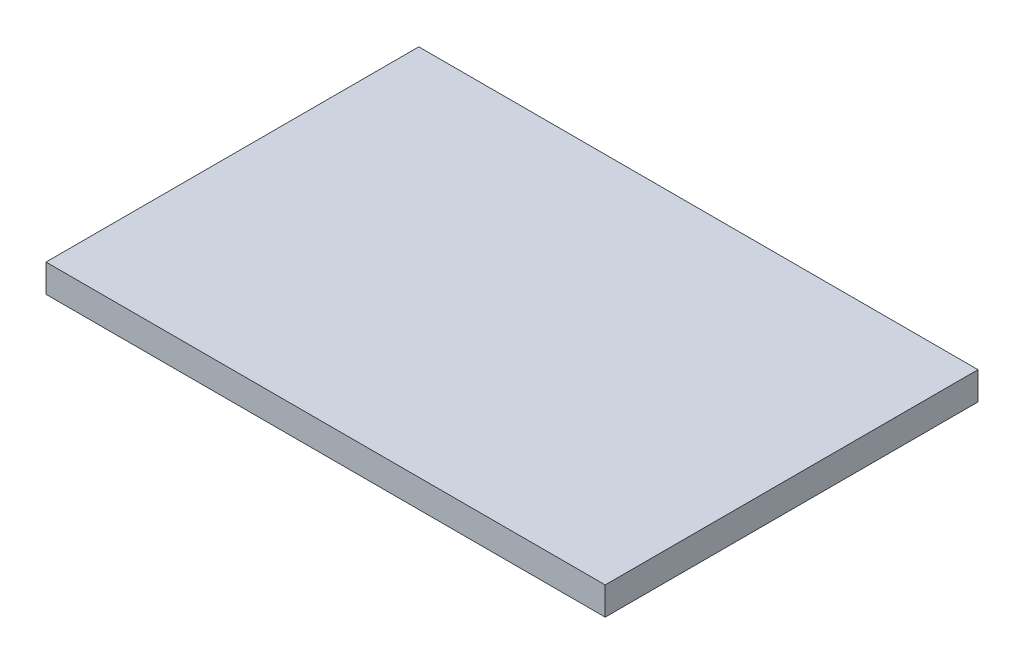
ISO-10303-21;
HEADER;
FILE_DESCRIPTION(('STEP AP214'),'2;1');
FILE_NAME('part.step','',(''),(''),'','','');
FILE_SCHEMA(('AUTOMOTIVE_DESIGN { 1 0 10303 214 1 1 1 1 }'));
ENDSEC;
DATA;
#1=APPLICATION_CONTEXT('core data for automotive mechanical design processes');
#2=APPLICATION_PROTOCOL_DEFINITION('international standard','automotive_design',2000,#1);
#3=PRODUCT_CONTEXT('',#1,'mechanical');
#4=PRODUCT('Part','Part','',(#3));
#5=PRODUCT_RELATED_PRODUCT_CATEGORY('part','',(#4));
#6=PRODUCT_DEFINITION_FORMATION('','',#4);
#7=PRODUCT_DEFINITION_CONTEXT('part definition',#1,'design');
#8=PRODUCT_DEFINITION('design','',#6,#7);
#9=PRODUCT_DEFINITION_SHAPE('','',#8);
#10=(LENGTH_UNIT() NAMED_UNIT(*) SI_UNIT(.MILLI.,.METRE.));
#11=(NAMED_UNIT(*) PLANE_ANGLE_UNIT() SI_UNIT($,.RADIAN.));
#12=(NAMED_UNIT(*) SI_UNIT($,.STERADIAN.) SOLID_ANGLE_UNIT());
#13=UNCERTAINTY_MEASURE_WITH_UNIT(LENGTH_MEASURE(1.E-05),#10,'distance_accuracy_value','');
#14=(GEOMETRIC_REPRESENTATION_CONTEXT(3) GLOBAL_UNCERTAINTY_ASSIGNED_CONTEXT((#13)) GLOBAL_UNIT_ASSIGNED_CONTEXT((#10,
#11,#12)) REPRESENTATION_CONTEXT('',''));
#15=CARTESIAN_POINT('',(0.,0.,0.));
#16=DIRECTION('',(0.,0.,1.));
#17=DIRECTION('',(1.,0.,0.));
#18=AXIS2_PLACEMENT_3D('',#15,#16,#17);
#19=CARTESIAN_POINT('',(0.,3.,0.));
#20=DIRECTION('',(1.,0.,0.));
#21=DIRECTION('',(0.,0.,-1.));
#22=AXIS2_PLACEMENT_3D('',#19,#20,#21);
#23=PLANE('',#22);
#24=DIRECTION('',(0.,0.,1.));
#25=VECTOR('',#24,1.);
#26=CARTESIAN_POINT('',(0.,0.,0.));
#27=LINE('',#26,#25);
#28=CARTESIAN_POINT('',(0.,0.,-40.));
#29=VERTEX_POINT('',#28);
#30=CARTESIAN_POINT('',(0.,0.,0.));
#31=VERTEX_POINT('',#30);
#32=EDGE_CURVE('E96',#29,#31,#27,.T.);
#33=ORIENTED_EDGE('',*,*,#32,.T.);
#34=DIRECTION('',(0.,-1.,0.));
#35=VECTOR('',#34,1.);
#36=CARTESIAN_POINT('',(0.,3.,0.));
#37=LINE('',#36,#35);
#38=CARTESIAN_POINT('',(0.,3.,0.));
#39=VERTEX_POINT('',#38);
#40=EDGE_CURVE('E11',#39,#31,#37,.T.);
#41=ORIENTED_EDGE('',*,*,#40,.F.);
#42=DIRECTION('',(0.,0.,1.));
#43=VECTOR('',#42,1.);
#44=CARTESIAN_POINT('',(0.,3.,0.));
#45=LINE('',#44,#43);
#46=CARTESIAN_POINT('',(0.,3.,-40.));
#47=VERTEX_POINT('',#46);
#48=EDGE_CURVE('E84',#47,#39,#45,.T.);
#49=ORIENTED_EDGE('',*,*,#48,.F.);
#50=DIRECTION('',(0.,-1.,0.));
#51=VECTOR('',#50,1.);
#52=CARTESIAN_POINT('',(0.,3.,-40.));
#53=LINE('',#52,#51);
#54=EDGE_CURVE('E92',#47,#29,#53,.T.);
#55=ORIENTED_EDGE('',*,*,#54,.T.);
#56=EDGE_LOOP('',(#33,#41,#49,#55));
#57=FACE_BOUND('',#56,.T.);
#58=ADVANCED_FACE('F33',(#57),#23,.F.);
#59=CARTESIAN_POINT('',(0.,3.,0.));
#60=DIRECTION('',(0.,0.,-1.));
#61=DIRECTION('',(-1.,0.,0.));
#62=AXIS2_PLACEMENT_3D('',#59,#60,#61);
#63=PLANE('',#62);
#64=DIRECTION('',(1.,0.,0.));
#65=VECTOR('',#64,1.);
#66=CARTESIAN_POINT('',(0.,0.,0.));
#67=LINE('',#66,#65);
#68=CARTESIAN_POINT('',(60.,0.,0.));
#69=VERTEX_POINT('',#68);
#70=EDGE_CURVE('E88',#31,#69,#67,.T.);
#71=ORIENTED_EDGE('',*,*,#70,.T.);
#72=DIRECTION('',(0.,-1.,0.));
#73=VECTOR('',#72,1.);
#74=CARTESIAN_POINT('',(60.,3.,0.));
#75=LINE('',#74,#73);
#76=CARTESIAN_POINT('',(60.,3.,0.));
#77=VERTEX_POINT('',#76);
#78=EDGE_CURVE('E41',#77,#69,#75,.T.);
#79=ORIENTED_EDGE('',*,*,#78,.F.);
#80=DIRECTION('',(1.,0.,0.));
#81=VECTOR('',#80,1.);
#82=CARTESIAN_POINT('',(0.,3.,0.));
#83=LINE('',#82,#81);
#84=EDGE_CURVE('E79',#39,#77,#83,.T.);
#85=ORIENTED_EDGE('',*,*,#84,.F.);
#86=ORIENTED_EDGE('',*,*,#40,.T.);
#87=EDGE_LOOP('',(#71,#79,#85,#86));
#88=FACE_BOUND('',#87,.T.);
#89=ADVANCED_FACE('F87',(#88),#63,.F.);
#90=CARTESIAN_POINT('',(60.,3.,0.));
#91=DIRECTION('',(-1.,0.,0.));
#92=DIRECTION('',(0.,0.,1.));
#93=AXIS2_PLACEMENT_3D('',#90,#91,#92);
#94=PLANE('',#93);
#95=DIRECTION('',(0.,0.,-1.));
#96=VECTOR('',#95,1.);
#97=CARTESIAN_POINT('',(60.,0.,0.));
#98=LINE('',#97,#96);
#99=CARTESIAN_POINT('',(60.,0.,-40.));
#100=VERTEX_POINT('',#99);
#101=EDGE_CURVE('E66',#69,#100,#98,.T.);
#102=ORIENTED_EDGE('',*,*,#101,.T.);
#103=DIRECTION('',(0.,-1.,0.));
#104=VECTOR('',#103,1.);
#105=CARTESIAN_POINT('',(60.,3.,-40.));
#106=LINE('',#105,#104);
#107=CARTESIAN_POINT('',(60.,3.,-40.));
#108=VERTEX_POINT('',#107);
#109=EDGE_CURVE('E89',#108,#100,#106,.T.);
#110=ORIENTED_EDGE('',*,*,#109,.F.);
#111=DIRECTION('',(0.,0.,-1.));
#112=VECTOR('',#111,1.);
#113=CARTESIAN_POINT('',(60.,3.,0.));
#114=LINE('',#113,#112);
#115=EDGE_CURVE('E82',#77,#108,#114,.T.);
#116=ORIENTED_EDGE('',*,*,#115,.F.);
#117=ORIENTED_EDGE('',*,*,#78,.T.);
#118=EDGE_LOOP('',(#102,#110,#116,#117));
#119=FACE_BOUND('',#118,.T.);
#120=ADVANCED_FACE('F90',(#119),#94,.F.);
#121=CARTESIAN_POINT('',(0.,3.,-40.));
#122=DIRECTION('',(0.,0.,1.));
#123=DIRECTION('',(1.,0.,0.));
#124=AXIS2_PLACEMENT_3D('',#121,#122,#123);
#125=PLANE('',#124);
#126=DIRECTION('',(-1.,0.,0.));
#127=VECTOR('',#126,1.);
#128=CARTESIAN_POINT('',(0.,0.,-40.));
#129=LINE('',#128,#127);
#130=EDGE_CURVE('E72',#100,#29,#129,.T.);
#131=ORIENTED_EDGE('',*,*,#130,.T.);
#132=ORIENTED_EDGE('',*,*,#54,.F.);
#133=DIRECTION('',(-1.,0.,0.));
#134=VECTOR('',#133,1.);
#135=CARTESIAN_POINT('',(0.,3.,-40.));
#136=LINE('',#135,#134);
#137=EDGE_CURVE('E49',#108,#47,#136,.T.);
#138=ORIENTED_EDGE('',*,*,#137,.F.);
#139=ORIENTED_EDGE('',*,*,#109,.T.);
#140=EDGE_LOOP('',(#131,#132,#138,#139));
#141=FACE_BOUND('',#140,.T.);
#142=ADVANCED_FACE('F103',(#141),#125,.F.);
#143=CARTESIAN_POINT('',(0.,3.,0.));
#144=DIRECTION('',(0.,-1.,0.));
#145=DIRECTION('',(0.,0.,-1.));
#146=AXIS2_PLACEMENT_3D('',#143,#144,#145);
#147=PLANE('',#146);
#148=ORIENTED_EDGE('',*,*,#48,.T.);
#149=ORIENTED_EDGE('',*,*,#84,.T.);
#150=ORIENTED_EDGE('',*,*,#115,.T.);
#151=ORIENTED_EDGE('',*,*,#137,.T.);
#152=EDGE_LOOP('',(#148,#149,#150,#151));
#153=FACE_BOUND('',#152,.T.);
#154=ADVANCED_FACE('F80',(#153),#147,.F.);
#155=CARTESIAN_POINT('',(0.,0.,0.));
#156=DIRECTION('',(0.,-1.,0.));
#157=DIRECTION('',(0.,0.,-1.));
#158=AXIS2_PLACEMENT_3D('',#155,#156,#157);
#159=PLANE('',#158);
#160=ORIENTED_EDGE('',*,*,#32,.F.);
#161=ORIENTED_EDGE('',*,*,#130,.F.);
#162=ORIENTED_EDGE('',*,*,#101,.F.);
#163=ORIENTED_EDGE('',*,*,#70,.F.);
#164=EDGE_LOOP('',(#160,#161,#162,#163));
#165=FACE_BOUND('',#164,.T.);
#166=ADVANCED_FACE('F106',(#165),#159,.T.);
#167=CLOSED_SHELL('',(#58,#89,#120,#142,#154,#166));
#168=MANIFOLD_SOLID_BREP('B2',#167);
#169=ADVANCED_BREP_SHAPE_REPRESENTATION('',(#18,#168),#14);
#170=SHAPE_DEFINITION_REPRESENTATION(#9,#169);
ENDSEC;
END-ISO-10303-21;
